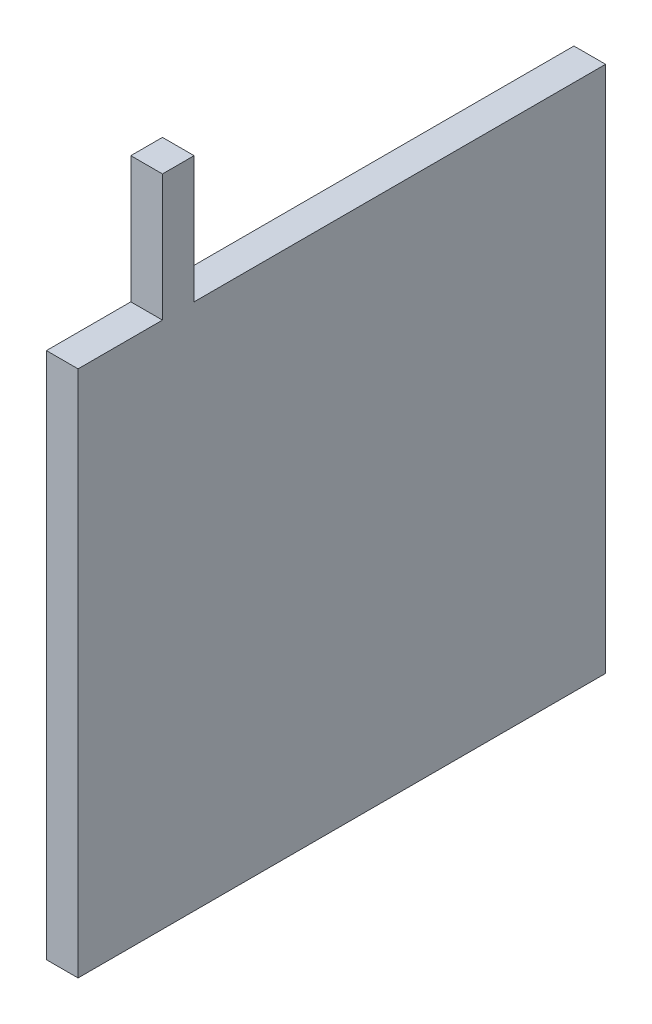
ISO-10303-21;
HEADER;
FILE_DESCRIPTION(('STEP AP214'),'2;1');
FILE_NAME('part.step','',(''),(''),'','','');
FILE_SCHEMA(('AUTOMOTIVE_DESIGN { 1 0 10303 214 1 1 1 1 }'));
ENDSEC;
DATA;
#1=APPLICATION_CONTEXT('core data for automotive mechanical design processes');
#2=APPLICATION_PROTOCOL_DEFINITION('international standard','automotive_design',2000,#1);
#3=PRODUCT_CONTEXT('',#1,'mechanical');
#4=PRODUCT('Part','Part','',(#3));
#5=PRODUCT_RELATED_PRODUCT_CATEGORY('part','',(#4));
#6=PRODUCT_DEFINITION_FORMATION('','',#4);
#7=PRODUCT_DEFINITION_CONTEXT('part definition',#1,'design');
#8=PRODUCT_DEFINITION('design','',#6,#7);
#9=PRODUCT_DEFINITION_SHAPE('','',#8);
#10=(LENGTH_UNIT() NAMED_UNIT(*) SI_UNIT(.MILLI.,.METRE.));
#11=(NAMED_UNIT(*) PLANE_ANGLE_UNIT() SI_UNIT($,.RADIAN.));
#12=(NAMED_UNIT(*) SI_UNIT($,.STERADIAN.) SOLID_ANGLE_UNIT());
#13=UNCERTAINTY_MEASURE_WITH_UNIT(LENGTH_MEASURE(1.E-05),#10,'distance_accuracy_value','');
#14=(GEOMETRIC_REPRESENTATION_CONTEXT(3) GLOBAL_UNCERTAINTY_ASSIGNED_CONTEXT((#13)) GLOBAL_UNIT_ASSIGNED_CONTEXT((#10,
#11,#12)) REPRESENTATION_CONTEXT('',''));
#15=CARTESIAN_POINT('',(0.,0.,0.));
#16=DIRECTION('',(0.,0.,1.));
#17=DIRECTION('',(1.,0.,0.));
#18=AXIS2_PLACEMENT_3D('',#15,#16,#17);
#19=CARTESIAN_POINT('',(3.,0.,-3.));
#20=DIRECTION('',(0.,-1.,0.));
#21=DIRECTION('',(0.,0.,-1.));
#22=AXIS2_PLACEMENT_3D('',#19,#20,#21);
#23=PLANE('',#22);
#24=DIRECTION('',(0.,0.,1.));
#25=VECTOR('',#24,1.);
#26=CARTESIAN_POINT('',(0.,0.,-3.));
#27=LINE('',#26,#25);
#28=CARTESIAN_POINT('',(0.,0.,-3.));
#29=VERTEX_POINT('',#28);
#30=CARTESIAN_POINT('',(0.,0.,0.));
#31=VERTEX_POINT('',#30);
#32=EDGE_CURVE('E129',#29,#31,#27,.T.);
#33=ORIENTED_EDGE('',*,*,#32,.T.);
#34=DIRECTION('',(-1.,0.,0.));
#35=VECTOR('',#34,1.);
#36=CARTESIAN_POINT('',(3.,0.,0.));
#37=LINE('',#36,#35);
#38=CARTESIAN_POINT('',(3.,0.,0.));
#39=VERTEX_POINT('',#38);
#40=EDGE_CURVE('E11',#39,#31,#37,.T.);
#41=ORIENTED_EDGE('',*,*,#40,.F.);
#42=DIRECTION('',(0.,0.,1.));
#43=VECTOR('',#42,1.);
#44=CARTESIAN_POINT('',(3.,0.,-3.));
#45=LINE('',#44,#43);
#46=CARTESIAN_POINT('',(3.,0.,-3.));
#47=VERTEX_POINT('',#46);
#48=EDGE_CURVE('E143',#47,#39,#45,.T.);
#49=ORIENTED_EDGE('',*,*,#48,.F.);
#50=DIRECTION('',(-1.,0.,0.));
#51=VECTOR('',#50,1.);
#52=CARTESIAN_POINT('',(3.,0.,-3.));
#53=LINE('',#52,#51);
#54=EDGE_CURVE('E125',#47,#29,#53,.T.);
#55=ORIENTED_EDGE('',*,*,#54,.T.);
#56=EDGE_LOOP('',(#33,#41,#49,#55));
#57=FACE_BOUND('',#56,.T.);
#58=ADVANCED_FACE('F33',(#57),#23,.F.);
#59=CARTESIAN_POINT('',(3.,0.,0.));
#60=DIRECTION('',(0.,0.,-1.));
#61=DIRECTION('',(0.,1.,0.));
#62=AXIS2_PLACEMENT_3D('',#59,#60,#61);
#63=PLANE('',#62);
#64=DIRECTION('',(0.,-1.,0.));
#65=VECTOR('',#64,1.);
#66=CARTESIAN_POINT('',(0.,0.,0.));
#67=LINE('',#66,#65);
#68=CARTESIAN_POINT('',(0.,-12.,0.));
#69=VERTEX_POINT('',#68);
#70=EDGE_CURVE('E132',#31,#69,#67,.T.);
#71=ORIENTED_EDGE('',*,*,#70,.T.);
#72=DIRECTION('',(-1.,0.,0.));
#73=VECTOR('',#72,1.);
#74=CARTESIAN_POINT('',(3.,-12.,0.));
#75=LINE('',#74,#73);
#76=CARTESIAN_POINT('',(3.,-12.,0.));
#77=VERTEX_POINT('',#76);
#78=EDGE_CURVE('E41',#77,#69,#75,.T.);
#79=ORIENTED_EDGE('',*,*,#78,.F.);
#80=DIRECTION('',(0.,-1.,0.));
#81=VECTOR('',#80,1.);
#82=CARTESIAN_POINT('',(3.,0.,0.));
#83=LINE('',#82,#81);
#84=EDGE_CURVE('E92',#39,#77,#83,.T.);
#85=ORIENTED_EDGE('',*,*,#84,.F.);
#86=ORIENTED_EDGE('',*,*,#40,.T.);
#87=EDGE_LOOP('',(#71,#79,#85,#86));
#88=FACE_BOUND('',#87,.T.);
#89=ADVANCED_FACE('F178',(#88),#63,.F.);
#90=CARTESIAN_POINT('',(3.,-12.,0.));
#91=DIRECTION('',(0.,-1.,0.));
#92=DIRECTION('',(0.,0.,-1.));
#93=AXIS2_PLACEMENT_3D('',#90,#91,#92);
#94=PLANE('',#93);
#95=DIRECTION('',(0.,0.,1.));
#96=VECTOR('',#95,1.);
#97=CARTESIAN_POINT('',(0.,-12.,0.));
#98=LINE('',#97,#96);
#99=CARTESIAN_POINT('',(0.,-12.,8.));
#100=VERTEX_POINT('',#99);
#101=EDGE_CURVE('E134',#69,#100,#98,.T.);
#102=ORIENTED_EDGE('',*,*,#101,.T.);
#103=DIRECTION('',(-1.,0.,0.));
#104=VECTOR('',#103,1.);
#105=CARTESIAN_POINT('',(3.,-12.,8.));
#106=LINE('',#105,#104);
#107=CARTESIAN_POINT('',(3.,-12.,8.));
#108=VERTEX_POINT('',#107);
#109=EDGE_CURVE('E150',#108,#100,#106,.T.);
#110=ORIENTED_EDGE('',*,*,#109,.F.);
#111=DIRECTION('',(0.,0.,1.));
#112=VECTOR('',#111,1.);
#113=CARTESIAN_POINT('',(3.,-12.,0.));
#114=LINE('',#113,#112);
#115=EDGE_CURVE('E158',#77,#108,#114,.T.);
#116=ORIENTED_EDGE('',*,*,#115,.F.);
#117=ORIENTED_EDGE('',*,*,#78,.T.);
#118=EDGE_LOOP('',(#102,#110,#116,#117));
#119=FACE_BOUND('',#118,.T.);
#120=ADVANCED_FACE('F156',(#119),#94,.F.);
#121=CARTESIAN_POINT('',(3.,-12.,8.));
#122=DIRECTION('',(0.,0.,-1.));
#123=DIRECTION('',(0.,1.,0.));
#124=AXIS2_PLACEMENT_3D('',#121,#122,#123);
#125=PLANE('',#124);
#126=DIRECTION('',(0.,-1.,0.));
#127=VECTOR('',#126,1.);
#128=CARTESIAN_POINT('',(0.,-12.,8.));
#129=LINE('',#128,#127);
#130=CARTESIAN_POINT('',(0.,-62.,7.99999999999999));
#131=VERTEX_POINT('',#130);
#132=EDGE_CURVE('E136',#100,#131,#129,.T.);
#133=ORIENTED_EDGE('',*,*,#132,.T.);
#134=DIRECTION('',(-1.,0.,0.));
#135=VECTOR('',#134,1.);
#136=CARTESIAN_POINT('',(3.,-62.,7.99999999999999));
#137=LINE('',#136,#135);
#138=CARTESIAN_POINT('',(3.,-62.,7.99999999999999));
#139=VERTEX_POINT('',#138);
#140=EDGE_CURVE('E147',#139,#131,#137,.T.);
#141=ORIENTED_EDGE('',*,*,#140,.F.);
#142=DIRECTION('',(0.,-1.,0.));
#143=VECTOR('',#142,1.);
#144=CARTESIAN_POINT('',(3.,-12.,8.));
#145=LINE('',#144,#143);
#146=EDGE_CURVE('E170',#108,#139,#145,.T.);
#147=ORIENTED_EDGE('',*,*,#146,.F.);
#148=ORIENTED_EDGE('',*,*,#109,.T.);
#149=EDGE_LOOP('',(#133,#141,#147,#148));
#150=FACE_BOUND('',#149,.T.);
#151=ADVANCED_FACE('F166',(#150),#125,.F.);
#152=CARTESIAN_POINT('',(3.,-62.,7.99999999999999));
#153=DIRECTION('',(0.,1.,0.));
#154=DIRECTION('',(0.,0.,1.));
#155=AXIS2_PLACEMENT_3D('',#152,#153,#154);
#156=PLANE('',#155);
#157=DIRECTION('',(0.,0.,-1.));
#158=VECTOR('',#157,1.);
#159=CARTESIAN_POINT('',(0.,-62.,7.99999999999999));
#160=LINE('',#159,#158);
#161=CARTESIAN_POINT('',(0.,-62.,-42.));
#162=VERTEX_POINT('',#161);
#163=EDGE_CURVE('E138',#131,#162,#160,.T.);
#164=ORIENTED_EDGE('',*,*,#163,.T.);
#165=DIRECTION('',(-1.,0.,0.));
#166=VECTOR('',#165,1.);
#167=CARTESIAN_POINT('',(3.,-62.,-42.));
#168=LINE('',#167,#166);
#169=CARTESIAN_POINT('',(3.,-62.,-42.));
#170=VERTEX_POINT('',#169);
#171=EDGE_CURVE('E120',#170,#162,#168,.T.);
#172=ORIENTED_EDGE('',*,*,#171,.F.);
#173=DIRECTION('',(0.,0.,-1.));
#174=VECTOR('',#173,1.);
#175=CARTESIAN_POINT('',(3.,-62.,7.99999999999999));
#176=LINE('',#175,#174);
#177=EDGE_CURVE('E111',#139,#170,#176,.T.);
#178=ORIENTED_EDGE('',*,*,#177,.F.);
#179=ORIENTED_EDGE('',*,*,#140,.T.);
#180=EDGE_LOOP('',(#164,#172,#178,#179));
#181=FACE_BOUND('',#180,.T.);
#182=ADVANCED_FACE('F169',(#181),#156,.F.);
#183=CARTESIAN_POINT('',(3.,-62.,-42.));
#184=DIRECTION('',(0.,0.,1.));
#185=DIRECTION('',(1.,0.,0.));
#186=AXIS2_PLACEMENT_3D('',#183,#184,#185);
#187=PLANE('',#186);
#188=DIRECTION('',(0.,1.,0.));
#189=VECTOR('',#188,1.);
#190=CARTESIAN_POINT('',(0.,-62.,-42.));
#191=LINE('',#190,#189);
#192=CARTESIAN_POINT('',(0.,-12.,-42.));
#193=VERTEX_POINT('',#192);
#194=EDGE_CURVE('E119',#162,#193,#191,.T.);
#195=ORIENTED_EDGE('',*,*,#194,.T.);
#196=DIRECTION('',(-1.,0.,0.));
#197=VECTOR('',#196,1.);
#198=CARTESIAN_POINT('',(3.,-12.,-42.));
#199=LINE('',#198,#197);
#200=CARTESIAN_POINT('',(3.,-12.,-42.));
#201=VERTEX_POINT('',#200);
#202=EDGE_CURVE('E116',#201,#193,#199,.T.);
#203=ORIENTED_EDGE('',*,*,#202,.F.);
#204=DIRECTION('',(0.,1.,0.));
#205=VECTOR('',#204,1.);
#206=CARTESIAN_POINT('',(3.,-62.,-42.));
#207=LINE('',#206,#205);
#208=EDGE_CURVE('E105',#170,#201,#207,.T.);
#209=ORIENTED_EDGE('',*,*,#208,.F.);
#210=ORIENTED_EDGE('',*,*,#171,.T.);
#211=EDGE_LOOP('',(#195,#203,#209,#210));
#212=FACE_BOUND('',#211,.T.);
#213=ADVANCED_FACE('F117',(#212),#187,.F.);
#214=CARTESIAN_POINT('',(3.,-12.,-42.));
#215=DIRECTION('',(0.,-1.,0.));
#216=DIRECTION('',(0.,0.,-1.));
#217=AXIS2_PLACEMENT_3D('',#214,#215,#216);
#218=PLANE('',#217);
#219=DIRECTION('',(0.,0.,1.));
#220=VECTOR('',#219,1.);
#221=CARTESIAN_POINT('',(0.,-12.,-42.));
#222=LINE('',#221,#220);
#223=CARTESIAN_POINT('',(0.,-12.,-3.));
#224=VERTEX_POINT('',#223);
#225=EDGE_CURVE('E78',#193,#224,#222,.T.);
#226=ORIENTED_EDGE('',*,*,#225,.T.);
#227=DIRECTION('',(-1.,0.,0.));
#228=VECTOR('',#227,1.);
#229=CARTESIAN_POINT('',(3.,-12.,-3.));
#230=LINE('',#229,#228);
#231=CARTESIAN_POINT('',(3.,-12.,-3.));
#232=VERTEX_POINT('',#231);
#233=EDGE_CURVE('E121',#232,#224,#230,.T.);
#234=ORIENTED_EDGE('',*,*,#233,.F.);
#235=DIRECTION('',(0.,0.,1.));
#236=VECTOR('',#235,1.);
#237=CARTESIAN_POINT('',(3.,-12.,-42.));
#238=LINE('',#237,#236);
#239=EDGE_CURVE('E109',#201,#232,#238,.T.);
#240=ORIENTED_EDGE('',*,*,#239,.F.);
#241=ORIENTED_EDGE('',*,*,#202,.T.);
#242=EDGE_LOOP('',(#226,#234,#240,#241));
#243=FACE_BOUND('',#242,.T.);
#244=ADVANCED_FACE('F123',(#243),#218,.F.);
#245=CARTESIAN_POINT('',(3.,-12.,-3.));
#246=DIRECTION('',(0.,0.,1.));
#247=DIRECTION('',(1.,0.,0.));
#248=AXIS2_PLACEMENT_3D('',#245,#246,#247);
#249=PLANE('',#248);
#250=DIRECTION('',(0.,1.,0.));
#251=VECTOR('',#250,1.);
#252=CARTESIAN_POINT('',(0.,-12.,-3.));
#253=LINE('',#252,#251);
#254=EDGE_CURVE('E84',#224,#29,#253,.T.);
#255=ORIENTED_EDGE('',*,*,#254,.T.);
#256=ORIENTED_EDGE('',*,*,#54,.F.);
#257=DIRECTION('',(0.,1.,0.));
#258=VECTOR('',#257,1.);
#259=CARTESIAN_POINT('',(3.,-12.,-3.));
#260=LINE('',#259,#258);
#261=EDGE_CURVE('E49',#232,#47,#260,.T.);
#262=ORIENTED_EDGE('',*,*,#261,.F.);
#263=ORIENTED_EDGE('',*,*,#233,.T.);
#264=EDGE_LOOP('',(#255,#256,#262,#263));
#265=FACE_BOUND('',#264,.T.);
#266=ADVANCED_FACE('F194',(#265),#249,.F.);
#267=CARTESIAN_POINT('',(3.,0.,0.));
#268=DIRECTION('',(1.,0.,0.));
#269=DIRECTION('',(0.,0.,-1.));
#270=AXIS2_PLACEMENT_3D('',#267,#268,#269);
#271=PLANE('',#270);
#272=ORIENTED_EDGE('',*,*,#48,.T.);
#273=ORIENTED_EDGE('',*,*,#84,.T.);
#274=ORIENTED_EDGE('',*,*,#115,.T.);
#275=ORIENTED_EDGE('',*,*,#146,.T.);
#276=ORIENTED_EDGE('',*,*,#177,.T.);
#277=ORIENTED_EDGE('',*,*,#208,.T.);
#278=ORIENTED_EDGE('',*,*,#239,.T.);
#279=ORIENTED_EDGE('',*,*,#261,.T.);
#280=EDGE_LOOP('',(#272,#273,#274,#275,#276,#277,#278,#279));
#281=FACE_BOUND('',#280,.T.);
#282=ADVANCED_FACE('F107',(#281),#271,.T.);
#283=CARTESIAN_POINT('',(0.,0.,0.));
#284=DIRECTION('',(1.,0.,0.));
#285=DIRECTION('',(0.,0.,-1.));
#286=AXIS2_PLACEMENT_3D('',#283,#284,#285);
#287=PLANE('',#286);
#288=ORIENTED_EDGE('',*,*,#32,.F.);
#289=ORIENTED_EDGE('',*,*,#254,.F.);
#290=ORIENTED_EDGE('',*,*,#225,.F.);
#291=ORIENTED_EDGE('',*,*,#194,.F.);
#292=ORIENTED_EDGE('',*,*,#163,.F.);
#293=ORIENTED_EDGE('',*,*,#132,.F.);
#294=ORIENTED_EDGE('',*,*,#101,.F.);
#295=ORIENTED_EDGE('',*,*,#70,.F.);
#296=EDGE_LOOP('',(#288,#289,#290,#291,#292,#293,#294,#295));
#297=FACE_BOUND('',#296,.T.);
#298=ADVANCED_FACE('F162',(#297),#287,.F.);
#299=CLOSED_SHELL('',(#58,#89,#120,#151,#182,#213,#244,#266,#282,#298));
#300=MANIFOLD_SOLID_BREP('B2',#299);
#301=ADVANCED_BREP_SHAPE_REPRESENTATION('',(#18,#300),#14);
#302=SHAPE_DEFINITION_REPRESENTATION(#9,#301);
ENDSEC;
END-ISO-10303-21;
